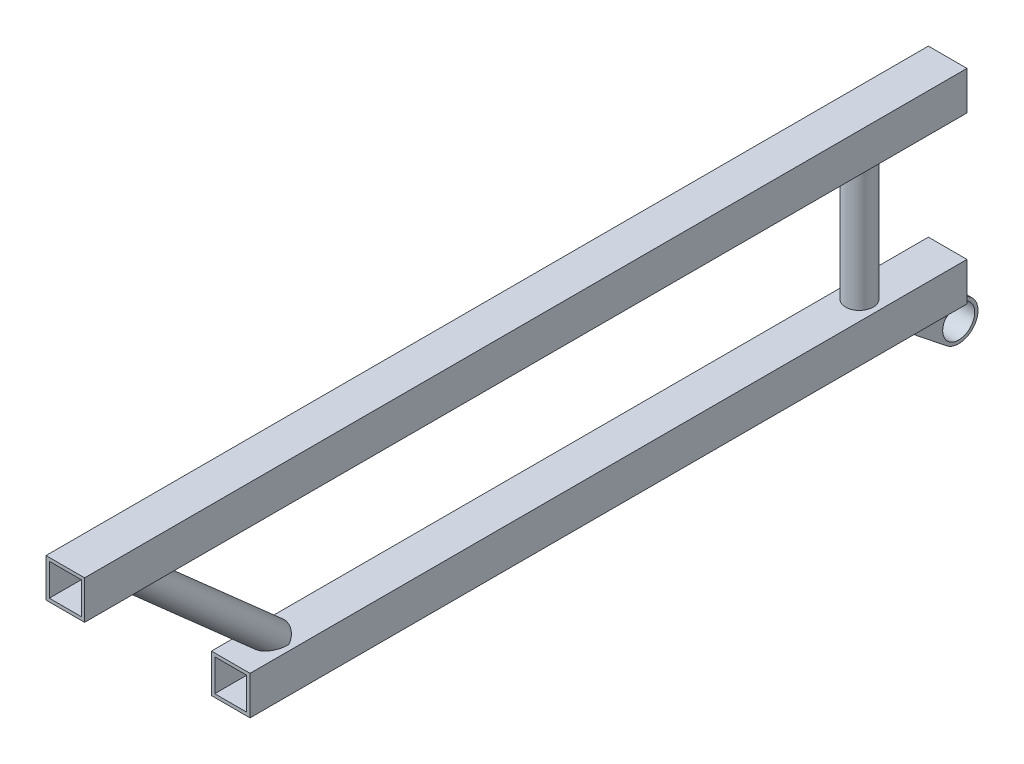
ISO-10303-21;
HEADER;
FILE_DESCRIPTION(('STEP AP214'),'2;1');
FILE_NAME('part.step','',(''),(''),'','','');
FILE_SCHEMA(('AUTOMOTIVE_DESIGN { 1 0 10303 214 1 1 1 1 }'));
ENDSEC;
DATA;
#1=APPLICATION_CONTEXT('core data for automotive mechanical design processes');
#2=APPLICATION_PROTOCOL_DEFINITION('international standard','automotive_design',2000,#1);
#3=PRODUCT_CONTEXT('',#1,'mechanical');
#4=PRODUCT('Part','Part','',(#3));
#5=PRODUCT_RELATED_PRODUCT_CATEGORY('part','',(#4));
#6=PRODUCT_DEFINITION_FORMATION('','',#4);
#7=PRODUCT_DEFINITION_CONTEXT('part definition',#1,'design');
#8=PRODUCT_DEFINITION('design','',#6,#7);
#9=PRODUCT_DEFINITION_SHAPE('','',#8);
#10=(LENGTH_UNIT() NAMED_UNIT(*) SI_UNIT(.MILLI.,.METRE.));
#11=(NAMED_UNIT(*) PLANE_ANGLE_UNIT() SI_UNIT($,.RADIAN.));
#12=(NAMED_UNIT(*) SI_UNIT($,.STERADIAN.) SOLID_ANGLE_UNIT());
#13=UNCERTAINTY_MEASURE_WITH_UNIT(LENGTH_MEASURE(1.E-05),#10,'distance_accuracy_value','');
#14=(GEOMETRIC_REPRESENTATION_CONTEXT(3) GLOBAL_UNCERTAINTY_ASSIGNED_CONTEXT((#13)) GLOBAL_UNIT_ASSIGNED_CONTEXT((#10,
#11,#12)) REPRESENTATION_CONTEXT('',''));
#15=CARTESIAN_POINT('',(0.,0.,0.));
#16=DIRECTION('',(0.,0.,1.));
#17=DIRECTION('',(1.,0.,0.));
#18=AXIS2_PLACEMENT_3D('',#15,#16,#17);
#19=CARTESIAN_POINT('',(0.,17.5,-40.));
#20=DIRECTION('',(0.,0.662573882203029,0.748996562490381));
#21=DIRECTION('',(0.,-0.748996562490381,0.662573882203029));
#22=AXIS2_PLACEMENT_3D('',#19,#20,#21);
#23=PLANE('',#22);
#24=DIRECTION('',(1.,0.,0.));
#25=VECTOR('',#24,1.);
#26=CARTESIAN_POINT('',(0.,17.5,-40.));
#27=LINE('',#26,#25);
#28=CARTESIAN_POINT('',(-12.5,17.5,-40.));
#29=VERTEX_POINT('',#28);
#30=CARTESIAN_POINT('',(-10.5,17.5,-40.));
#31=VERTEX_POINT('',#30);
#32=EDGE_CURVE('E300',#29,#31,#27,.T.);
#33=ORIENTED_EDGE('',*,*,#32,.F.);
#34=CARTESIAN_POINT('',(0.,17.5,-40.));
#35=DIRECTION('',(0.,0.662573882203029,0.748996562490381));
#36=DIRECTION('',(0.,-0.748996562490381,0.662573882203029));
#37=AXIS2_PLACEMENT_3D('',#34,#35,#36);
#38=CIRCLE('',#37,12.5);
#39=CARTESIAN_POINT('',(12.5,17.5,-40.));
#40=VERTEX_POINT('',#39);
#41=EDGE_CURVE('E308',#40,#29,#38,.T.);
#42=ORIENTED_EDGE('',*,*,#41,.F.);
#43=CARTESIAN_POINT('',(10.5,17.5,-40.));
#44=VERTEX_POINT('',#43);
#45=EDGE_CURVE('E297',#44,#40,#27,.T.);
#46=ORIENTED_EDGE('',*,*,#45,.F.);
#47=CARTESIAN_POINT('',(0.,17.5,-40.));
#48=DIRECTION('',(0.,0.662573882203029,0.748996562490381));
#49=DIRECTION('',(0.,-0.748996562490381,0.662573882203029));
#50=AXIS2_PLACEMENT_3D('',#47,#48,#49);
#51=CIRCLE('',#50,10.5);
#52=EDGE_CURVE('E312',#44,#31,#51,.T.);
#53=ORIENTED_EDGE('',*,*,#52,.T.);
#54=EDGE_LOOP('',(#33,#42,#46,#53));
#55=FACE_BOUND('',#54,.T.);
#56=ADVANCED_FACE('F42',(#55),#23,.F.);
#57=CARTESIAN_POINT('',(0.,161.890431658235,123.223966222353));
#58=DIRECTION('',(0.,-0.662573882203029,-0.748996562490381));
#59=DIRECTION('',(0.,0.748996562490381,-0.662573882203029));
#60=AXIS2_PLACEMENT_3D('',#57,#58,#59);
#61=CYLINDRICAL_SURFACE('',#60,12.5);
#62=CARTESIAN_POINT('',(0.,132.5,90.));
#63=DIRECTION('',(0.,-1.,0.));
#64=DIRECTION('',(0.,0.,-1.));
#65=AXIS2_PLACEMENT_3D('',#62,#63,#64);
#66=ELLIPSE('',#65,18.8658206062063,12.5);
#67=CARTESIAN_POINT('',(0.,132.5,71.1341793937937));
#68=VERTEX_POINT('',#67);
#69=EDGE_CURVE('E309',#68,#68,#66,.T.);
#70=ORIENTED_EDGE('',*,*,#69,.T.);
#71=EDGE_LOOP('',(#70));
#72=FACE_BOUND('',#71,.T.);
#73=CARTESIAN_POINT('',(0.,17.5,-40.));
#74=DIRECTION('',(0.,-1.,0.));
#75=DIRECTION('',(0.,0.,-1.));
#76=AXIS2_PLACEMENT_3D('',#73,#74,#75);
#77=ELLIPSE('',#76,18.8658206062063,12.5);
#78=EDGE_CURVE('E301',#40,#29,#77,.T.);
#79=ORIENTED_EDGE('',*,*,#78,.F.);
#80=ORIENTED_EDGE('',*,*,#41,.T.);
#81=EDGE_LOOP('',(#79,#80));
#82=FACE_BOUND('',#81,.T.);
#83=ADVANCED_FACE('F566',(#72,#82),#61,.T.);
#84=CARTESIAN_POINT('',(0.,161.890431658235,123.223966222353));
#85=DIRECTION('',(0.,-0.662573882203029,-0.748996562490381));
#86=DIRECTION('',(0.,0.748996562490381,-0.662573882203029));
#87=AXIS2_PLACEMENT_3D('',#84,#85,#86);
#88=CYLINDRICAL_SURFACE('',#87,10.5);
#89=CARTESIAN_POINT('',(0.,132.5,90.));
#90=DIRECTION('',(0.,-1.,0.));
#91=DIRECTION('',(0.,0.,-1.));
#92=AXIS2_PLACEMENT_3D('',#89,#90,#91);
#93=ELLIPSE('',#92,15.8472893092133,10.5);
#94=CARTESIAN_POINT('',(0.,132.5,74.1527106907867));
#95=VERTEX_POINT('',#94);
#96=EDGE_CURVE('E389',#95,#95,#93,.F.);
#97=ORIENTED_EDGE('',*,*,#96,.T.);
#98=EDGE_LOOP('',(#97));
#99=FACE_BOUND('',#98,.T.);
#100=ORIENTED_EDGE('',*,*,#52,.F.);
#101=CARTESIAN_POINT('',(0.,17.5,-40.));
#102=DIRECTION('',(0.,-1.,0.));
#103=DIRECTION('',(0.,0.,-1.));
#104=AXIS2_PLACEMENT_3D('',#101,#102,#103);
#105=ELLIPSE('',#104,15.8472893092133,10.5);
#106=EDGE_CURVE('E408',#44,#31,#105,.T.);
#107=ORIENTED_EDGE('',*,*,#106,.T.);
#108=EDGE_LOOP('',(#100,#107));
#109=FACE_BOUND('',#108,.T.);
#110=ADVANCED_FACE('F570',(#99,#109),#88,.F.);
#111=CARTESIAN_POINT('',(-17.5000000000001,0.,150.));
#112=DIRECTION('',(1.,0.,0.));
#113=DIRECTION('',(0.,1.,0.));
#114=AXIS2_PLACEMENT_3D('',#111,#112,#113);
#115=PLANE('',#114);
#116=DIRECTION('',(0.,-1.,0.));
#117=VECTOR('',#116,1.);
#118=CARTESIAN_POINT('',(-17.5000000000001,0.,-650.));
#119=LINE('',#118,#117);
#120=CARTESIAN_POINT('',(-17.5,167.5,-650.));
#121=VERTEX_POINT('',#120);
#122=CARTESIAN_POINT('',(-17.5,132.5,-650.));
#123=VERTEX_POINT('',#122);
#124=EDGE_CURVE('E361',#121,#123,#119,.T.);
#125=ORIENTED_EDGE('',*,*,#124,.T.);
#126=DIRECTION('',(0.,0.,-1.));
#127=VECTOR('',#126,1.);
#128=CARTESIAN_POINT('',(-17.5,132.5,150.));
#129=LINE('',#128,#127);
#130=CARTESIAN_POINT('',(-17.5,132.5,150.));
#131=VERTEX_POINT('',#130);
#132=EDGE_CURVE('E386',#131,#123,#129,.T.);
#133=ORIENTED_EDGE('',*,*,#132,.F.);
#134=DIRECTION('',(0.,-1.,0.));
#135=VECTOR('',#134,1.);
#136=CARTESIAN_POINT('',(-17.5000000000001,0.,150.));
#137=LINE('',#136,#135);
#138=CARTESIAN_POINT('',(-17.5,167.5,150.));
#139=VERTEX_POINT('',#138);
#140=EDGE_CURVE('E331',#139,#131,#137,.T.);
#141=ORIENTED_EDGE('',*,*,#140,.F.);
#142=DIRECTION('',(0.,0.,-1.));
#143=VECTOR('',#142,1.);
#144=CARTESIAN_POINT('',(-17.5,167.5,150.));
#145=LINE('',#144,#143);
#146=EDGE_CURVE('E375',#139,#121,#145,.T.);
#147=ORIENTED_EDGE('',*,*,#146,.T.);
#148=EDGE_LOOP('',(#125,#133,#141,#147));
#149=FACE_BOUND('',#148,.T.);
#150=ADVANCED_FACE('F589',(#149),#115,.F.);
#151=CARTESIAN_POINT('',(0.,132.5,150.));
#152=DIRECTION('',(0.,-1.,0.));
#153=DIRECTION('',(0.,0.,-1.));
#154=AXIS2_PLACEMENT_3D('',#151,#152,#153);
#155=PLANE('',#154);
#156=CARTESIAN_POINT('',(0.,132.5,-570.));
#157=DIRECTION('',(0.,-1.,0.));
#158=DIRECTION('',(0.,0.,-1.));
#159=AXIS2_PLACEMENT_3D('',#156,#157,#158);
#160=CIRCLE('',#159,12.5);
#161=CARTESIAN_POINT('',(0.,132.5,-582.5));
#162=VERTEX_POINT('',#161);
#163=EDGE_CURVE('E489',#162,#162,#160,.T.);
#164=ORIENTED_EDGE('',*,*,#163,.F.);
#165=EDGE_LOOP('',(#164));
#166=FACE_BOUND('',#165,.T.);
#167=ORIENTED_EDGE('',*,*,#69,.F.);
#168=EDGE_LOOP('',(#167));
#169=FACE_BOUND('',#168,.T.);
#170=DIRECTION('',(-1.,0.,0.));
#171=VECTOR('',#170,1.);
#172=CARTESIAN_POINT('',(0.,132.5,-650.));
#173=LINE('',#172,#171);
#174=CARTESIAN_POINT('',(17.5,132.5,-650.));
#175=VERTEX_POINT('',#174);
#176=EDGE_CURVE('E365',#175,#123,#173,.T.);
#177=ORIENTED_EDGE('',*,*,#176,.F.);
#178=DIRECTION('',(0.,0.,-1.));
#179=VECTOR('',#178,1.);
#180=CARTESIAN_POINT('',(17.5,132.5,150.));
#181=LINE('',#180,#179);
#182=CARTESIAN_POINT('',(17.5,132.5,150.));
#183=VERTEX_POINT('',#182);
#184=EDGE_CURVE('E383',#183,#175,#181,.T.);
#185=ORIENTED_EDGE('',*,*,#184,.F.);
#186=DIRECTION('',(-1.,0.,0.));
#187=VECTOR('',#186,1.);
#188=CARTESIAN_POINT('',(0.,132.5,150.));
#189=LINE('',#188,#187);
#190=EDGE_CURVE('E334',#183,#131,#189,.T.);
#191=ORIENTED_EDGE('',*,*,#190,.T.);
#192=ORIENTED_EDGE('',*,*,#132,.T.);
#193=EDGE_LOOP('',(#177,#185,#191,#192));
#194=FACE_BOUND('',#193,.T.);
#195=ADVANCED_FACE('F512',(#166,#169,#194),#155,.T.);
#196=CARTESIAN_POINT('',(17.5,0.,150.));
#197=DIRECTION('',(1.,0.,0.));
#198=DIRECTION('',(0.,1.,0.));
#199=AXIS2_PLACEMENT_3D('',#196,#197,#198);
#200=PLANE('',#199);
#201=DIRECTION('',(0.,-1.,0.));
#202=VECTOR('',#201,1.);
#203=CARTESIAN_POINT('',(17.5,0.,-650.));
#204=LINE('',#203,#202);
#205=CARTESIAN_POINT('',(17.5,167.5,-650.));
#206=VERTEX_POINT('',#205);
#207=EDGE_CURVE('E369',#206,#175,#204,.T.);
#208=ORIENTED_EDGE('',*,*,#207,.F.);
#209=DIRECTION('',(0.,0.,-1.));
#210=VECTOR('',#209,1.);
#211=CARTESIAN_POINT('',(17.5,167.5,150.));
#212=LINE('',#211,#210);
#213=CARTESIAN_POINT('',(17.5,167.5,150.));
#214=VERTEX_POINT('',#213);
#215=EDGE_CURVE('E379',#214,#206,#212,.T.);
#216=ORIENTED_EDGE('',*,*,#215,.F.);
#217=DIRECTION('',(0.,-1.,0.));
#218=VECTOR('',#217,1.);
#219=CARTESIAN_POINT('',(17.5,0.,150.));
#220=LINE('',#219,#218);
#221=EDGE_CURVE('E338',#214,#183,#220,.T.);
#222=ORIENTED_EDGE('',*,*,#221,.T.);
#223=ORIENTED_EDGE('',*,*,#184,.T.);
#224=EDGE_LOOP('',(#208,#216,#222,#223));
#225=FACE_BOUND('',#224,.T.);
#226=ADVANCED_FACE('F584',(#225),#200,.T.);
#227=CARTESIAN_POINT('',(0.,135.5,150.));
#228=DIRECTION('',(0.,-1.,0.));
#229=DIRECTION('',(0.,0.,-1.));
#230=AXIS2_PLACEMENT_3D('',#227,#228,#229);
#231=PLANE('',#230);
#232=DIRECTION('',(-1.,0.,0.));
#233=VECTOR('',#232,1.);
#234=CARTESIAN_POINT('',(0.,135.5,-650.));
#235=LINE('',#234,#233);
#236=CARTESIAN_POINT('',(14.5,135.5,-650.));
#237=VERTEX_POINT('',#236);
#238=CARTESIAN_POINT('',(-14.5,135.5,-650.));
#239=VERTEX_POINT('',#238);
#240=EDGE_CURVE('E346',#237,#239,#235,.T.);
#241=ORIENTED_EDGE('',*,*,#240,.T.);
#242=DIRECTION('',(0.,0.,-1.));
#243=VECTOR('',#242,1.);
#244=CARTESIAN_POINT('',(-14.5,135.5,150.));
#245=LINE('',#244,#243);
#246=CARTESIAN_POINT('',(-14.5,135.5,150.));
#247=VERTEX_POINT('',#246);
#248=EDGE_CURVE('E380',#247,#239,#245,.T.);
#249=ORIENTED_EDGE('',*,*,#248,.F.);
#250=DIRECTION('',(-1.,0.,0.));
#251=VECTOR('',#250,1.);
#252=CARTESIAN_POINT('',(0.,135.5,150.));
#253=LINE('',#252,#251);
#254=CARTESIAN_POINT('',(14.5,135.5,150.));
#255=VERTEX_POINT('',#254);
#256=EDGE_CURVE('E316',#255,#247,#253,.T.);
#257=ORIENTED_EDGE('',*,*,#256,.F.);
#258=DIRECTION('',(0.,0.,-1.));
#259=VECTOR('',#258,1.);
#260=CARTESIAN_POINT('',(14.5,135.5,150.));
#261=LINE('',#260,#259);
#262=EDGE_CURVE('E345',#255,#237,#261,.T.);
#263=ORIENTED_EDGE('',*,*,#262,.T.);
#264=EDGE_LOOP('',(#241,#249,#257,#263));
#265=FACE_BOUND('',#264,.T.);
#266=ADVANCED_FACE('F44',(#265),#231,.F.);
#267=CARTESIAN_POINT('',(-14.5,0.,150.));
#268=DIRECTION('',(1.,0.,0.));
#269=DIRECTION('',(0.,1.,0.));
#270=AXIS2_PLACEMENT_3D('',#267,#268,#269);
#271=PLANE('',#270);
#272=DIRECTION('',(0.,-1.,0.));
#273=VECTOR('',#272,1.);
#274=CARTESIAN_POINT('',(-14.5,0.,-650.));
#275=LINE('',#274,#273);
#276=CARTESIAN_POINT('',(-14.5,164.5,-650.));
#277=VERTEX_POINT('',#276);
#278=EDGE_CURVE('E350',#277,#239,#275,.T.);
#279=ORIENTED_EDGE('',*,*,#278,.F.);
#280=DIRECTION('',(0.,0.,-1.));
#281=VECTOR('',#280,1.);
#282=CARTESIAN_POINT('',(-14.5,164.5,150.));
#283=LINE('',#282,#281);
#284=CARTESIAN_POINT('',(-14.5,164.5,150.));
#285=VERTEX_POINT('',#284);
#286=EDGE_CURVE('E396',#285,#277,#283,.T.);
#287=ORIENTED_EDGE('',*,*,#286,.F.);
#288=DIRECTION('',(0.,-1.,0.));
#289=VECTOR('',#288,1.);
#290=CARTESIAN_POINT('',(-14.5,0.,150.));
#291=LINE('',#290,#289);
#292=EDGE_CURVE('E319',#285,#247,#291,.T.);
#293=ORIENTED_EDGE('',*,*,#292,.T.);
#294=ORIENTED_EDGE('',*,*,#248,.T.);
#295=EDGE_LOOP('',(#279,#287,#293,#294));
#296=FACE_BOUND('',#295,.T.);
#297=ADVANCED_FACE('F599',(#296),#271,.T.);
#298=CARTESIAN_POINT('',(0.,164.5,150.));
#299=DIRECTION('',(0.,-1.,0.));
#300=DIRECTION('',(0.,0.,-1.));
#301=AXIS2_PLACEMENT_3D('',#298,#299,#300);
#302=PLANE('',#301);
#303=DIRECTION('',(-1.,0.,0.));
#304=VECTOR('',#303,1.);
#305=CARTESIAN_POINT('',(0.,164.5,-650.));
#306=LINE('',#305,#304);
#307=CARTESIAN_POINT('',(14.5,164.5,-650.));
#308=VERTEX_POINT('',#307);
#309=EDGE_CURVE('E354',#308,#277,#306,.T.);
#310=ORIENTED_EDGE('',*,*,#309,.F.);
#311=DIRECTION('',(0.,0.,-1.));
#312=VECTOR('',#311,1.);
#313=CARTESIAN_POINT('',(14.5,164.5,150.));
#314=LINE('',#313,#312);
#315=CARTESIAN_POINT('',(14.5,164.5,150.));
#316=VERTEX_POINT('',#315);
#317=EDGE_CURVE('E393',#316,#308,#314,.T.);
#318=ORIENTED_EDGE('',*,*,#317,.F.);
#319=DIRECTION('',(-1.,0.,0.));
#320=VECTOR('',#319,1.);
#321=CARTESIAN_POINT('',(0.,164.5,150.));
#322=LINE('',#321,#320);
#323=EDGE_CURVE('E324',#316,#285,#322,.T.);
#324=ORIENTED_EDGE('',*,*,#323,.T.);
#325=ORIENTED_EDGE('',*,*,#286,.T.);
#326=EDGE_LOOP('',(#310,#318,#324,#325));
#327=FACE_BOUND('',#326,.T.);
#328=ADVANCED_FACE('F596',(#327),#302,.T.);
#329=CARTESIAN_POINT('',(14.5,0.,150.));
#330=DIRECTION('',(1.,0.,0.));
#331=DIRECTION('',(0.,1.,0.));
#332=AXIS2_PLACEMENT_3D('',#329,#330,#331);
#333=PLANE('',#332);
#334=DIRECTION('',(0.,-1.,0.));
#335=VECTOR('',#334,1.);
#336=CARTESIAN_POINT('',(14.5,0.,-650.));
#337=LINE('',#336,#335);
#338=EDGE_CURVE('E358',#308,#237,#337,.T.);
#339=ORIENTED_EDGE('',*,*,#338,.T.);
#340=ORIENTED_EDGE('',*,*,#262,.F.);
#341=DIRECTION('',(0.,-1.,0.));
#342=VECTOR('',#341,1.);
#343=CARTESIAN_POINT('',(14.5,0.,150.));
#344=LINE('',#343,#342);
#345=EDGE_CURVE('E328',#316,#255,#344,.T.);
#346=ORIENTED_EDGE('',*,*,#345,.F.);
#347=ORIENTED_EDGE('',*,*,#317,.T.);
#348=EDGE_LOOP('',(#339,#340,#346,#347));
#349=FACE_BOUND('',#348,.T.);
#350=ADVANCED_FACE('F582',(#349),#333,.F.);
#351=CARTESIAN_POINT('',(1.32830254731938E-13,167.5,150.));
#352=DIRECTION('',(0.,-1.,0.));
#353=DIRECTION('',(1.,0.,0.));
#354=AXIS2_PLACEMENT_3D('',#351,#352,#353);
#355=PLANE('',#354);
#356=DIRECTION('',(-1.,0.,0.));
#357=VECTOR('',#356,1.);
#358=CARTESIAN_POINT('',(1.32830254731938E-13,167.5,-650.));
#359=LINE('',#358,#357);
#360=EDGE_CURVE('E320',#206,#121,#359,.T.);
#361=ORIENTED_EDGE('',*,*,#360,.T.);
#362=ORIENTED_EDGE('',*,*,#146,.F.);
#363=DIRECTION('',(-1.,0.,0.));
#364=VECTOR('',#363,1.);
#365=CARTESIAN_POINT('',(1.32830254731938E-13,167.5,150.));
#366=LINE('',#365,#364);
#367=EDGE_CURVE('E342',#214,#139,#366,.T.);
#368=ORIENTED_EDGE('',*,*,#367,.F.);
#369=ORIENTED_EDGE('',*,*,#215,.T.);
#370=EDGE_LOOP('',(#361,#362,#368,#369));
#371=FACE_BOUND('',#370,.T.);
#372=ADVANCED_FACE('F575',(#371),#355,.F.);
#373=CARTESIAN_POINT('',(0.,0.,150.));
#374=DIRECTION('',(0.,0.,1.));
#375=DIRECTION('',(1.,0.,0.));
#376=AXIS2_PLACEMENT_3D('',#373,#374,#375);
#377=PLANE('',#376);
#378=ORIENTED_EDGE('',*,*,#256,.T.);
#379=ORIENTED_EDGE('',*,*,#292,.F.);
#380=ORIENTED_EDGE('',*,*,#323,.F.);
#381=ORIENTED_EDGE('',*,*,#345,.T.);
#382=EDGE_LOOP('',(#378,#379,#380,#381));
#383=FACE_BOUND('',#382,.T.);
#384=ORIENTED_EDGE('',*,*,#140,.T.);
#385=ORIENTED_EDGE('',*,*,#190,.F.);
#386=ORIENTED_EDGE('',*,*,#221,.F.);
#387=ORIENTED_EDGE('',*,*,#367,.T.);
#388=EDGE_LOOP('',(#384,#385,#386,#387));
#389=FACE_BOUND('',#388,.T.);
#390=ADVANCED_FACE('F571',(#383,#389),#377,.T.);
#391=CARTESIAN_POINT('',(0.,0.,-650.));
#392=DIRECTION('',(0.,0.,1.));
#393=DIRECTION('',(1.,0.,0.));
#394=AXIS2_PLACEMENT_3D('',#391,#392,#393);
#395=PLANE('',#394);
#396=ORIENTED_EDGE('',*,*,#240,.F.);
#397=ORIENTED_EDGE('',*,*,#338,.F.);
#398=ORIENTED_EDGE('',*,*,#309,.T.);
#399=ORIENTED_EDGE('',*,*,#278,.T.);
#400=EDGE_LOOP('',(#396,#397,#398,#399));
#401=FACE_BOUND('',#400,.T.);
#402=ORIENTED_EDGE('',*,*,#124,.F.);
#403=ORIENTED_EDGE('',*,*,#360,.F.);
#404=ORIENTED_EDGE('',*,*,#207,.T.);
#405=ORIENTED_EDGE('',*,*,#176,.T.);
#406=EDGE_LOOP('',(#402,#403,#404,#405));
#407=FACE_BOUND('',#406,.T.);
#408=ADVANCED_FACE('F574',(#401,#407),#395,.F.);
#409=ORIENTED_EDGE('',*,*,#96,.F.);
#410=EDGE_LOOP('',(#409));
#411=FACE_BOUND('',#410,.T.);
#412=ADVANCED_FACE('F511',(#411),#155,.T.);
#413=CARTESIAN_POINT('',(0.,-17.5,0.));
#414=DIRECTION('',(0.,-1.,0.));
#415=DIRECTION('',(0.,0.,-1.));
#416=AXIS2_PLACEMENT_3D('',#413,#414,#415);
#417=PLANE('',#416);
#418=DIRECTION('',(-1.,0.,0.));
#419=VECTOR('',#418,1.);
#420=CARTESIAN_POINT('',(0.,-17.5,-650.));
#421=LINE('',#420,#419);
#422=CARTESIAN_POINT('',(-10.,-17.5,-650.));
#423=VERTEX_POINT('',#422);
#424=CARTESIAN_POINT('',(-17.5,-17.5,-650.));
#425=VERTEX_POINT('',#424);
#426=EDGE_CURVE('E242',#423,#425,#421,.T.);
#427=ORIENTED_EDGE('',*,*,#426,.F.);
#428=DIRECTION('',(0.,0.,1.));
#429=VECTOR('',#428,1.);
#430=CARTESIAN_POINT('',(-10.,-17.5,-600.));
#431=LINE('',#430,#429);
#432=CARTESIAN_POINT('',(-10.,-17.5,-600.));
#433=VERTEX_POINT('',#432);
#434=EDGE_CURVE('E475',#423,#433,#431,.T.);
#435=ORIENTED_EDGE('',*,*,#434,.T.);
#436=DIRECTION('',(1.,0.,0.));
#437=VECTOR('',#436,1.);
#438=CARTESIAN_POINT('',(-10.,-17.5,-600.));
#439=LINE('',#438,#437);
#440=CARTESIAN_POINT('',(10.,-17.5,-600.));
#441=VERTEX_POINT('',#440);
#442=EDGE_CURVE('E210',#433,#441,#439,.T.);
#443=ORIENTED_EDGE('',*,*,#442,.T.);
#444=DIRECTION('',(0.,0.,1.));
#445=VECTOR('',#444,1.);
#446=CARTESIAN_POINT('',(10.,-17.5,-600.));
#447=LINE('',#446,#445);
#448=CARTESIAN_POINT('',(10.,-17.5000000000001,-650.));
#449=VERTEX_POINT('',#448);
#450=EDGE_CURVE('E218',#449,#441,#447,.T.);
#451=ORIENTED_EDGE('',*,*,#450,.F.);
#452=CARTESIAN_POINT('',(17.5,-17.5,-650.));
#453=VERTEX_POINT('',#452);
#454=EDGE_CURVE('E229',#453,#449,#421,.T.);
#455=ORIENTED_EDGE('',*,*,#454,.F.);
#456=DIRECTION('',(0.,0.,-1.));
#457=VECTOR('',#456,1.);
#458=CARTESIAN_POINT('',(17.5,-17.5,0.));
#459=LINE('',#458,#457);
#460=CARTESIAN_POINT('',(17.5,-17.5,0.));
#461=VERTEX_POINT('',#460);
#462=EDGE_CURVE('E281',#461,#453,#459,.T.);
#463=ORIENTED_EDGE('',*,*,#462,.F.);
#464=DIRECTION('',(-1.,0.,0.));
#465=VECTOR('',#464,1.);
#466=CARTESIAN_POINT('',(0.,-17.5,0.));
#467=LINE('',#466,#465);
#468=CARTESIAN_POINT('',(-17.5,-17.5,0.));
#469=VERTEX_POINT('',#468);
#470=EDGE_CURVE('E457',#461,#469,#467,.T.);
#471=ORIENTED_EDGE('',*,*,#470,.T.);
#472=DIRECTION('',(0.,0.,-1.));
#473=VECTOR('',#472,1.);
#474=CARTESIAN_POINT('',(-17.5,-17.5,0.));
#475=LINE('',#474,#473);
#476=EDGE_CURVE('E277',#469,#425,#475,.T.);
#477=ORIENTED_EDGE('',*,*,#476,.T.);
#478=EDGE_LOOP('',(#427,#435,#443,#451,#455,#463,#471,#477));
#479=FACE_BOUND('',#478,.T.);
#480=ADVANCED_FACE('F228',(#479),#417,.T.);
#481=CARTESIAN_POINT('',(14.5,0.,0.));
#482=DIRECTION('',(1.,0.,0.));
#483=DIRECTION('',(0.,1.,0.));
#484=AXIS2_PLACEMENT_3D('',#481,#482,#483);
#485=PLANE('',#484);
#486=DIRECTION('',(0.,-1.,0.));
#487=VECTOR('',#486,1.);
#488=CARTESIAN_POINT('',(14.5,0.,-650.));
#489=LINE('',#488,#487);
#490=CARTESIAN_POINT('',(14.5,14.5,-650.));
#491=VERTEX_POINT('',#490);
#492=CARTESIAN_POINT('',(14.5,-14.5,-650.));
#493=VERTEX_POINT('',#492);
#494=EDGE_CURVE('E241',#491,#493,#489,.T.);
#495=ORIENTED_EDGE('',*,*,#494,.T.);
#496=DIRECTION('',(0.,0.,-1.));
#497=VECTOR('',#496,1.);
#498=CARTESIAN_POINT('',(14.5,-14.5,0.));
#499=LINE('',#498,#497);
#500=CARTESIAN_POINT('',(14.5,-14.5,0.));
#501=VERTEX_POINT('',#500);
#502=EDGE_CURVE('E264',#501,#493,#499,.T.);
#503=ORIENTED_EDGE('',*,*,#502,.F.);
#504=DIRECTION('',(0.,-1.,0.));
#505=VECTOR('',#504,1.);
#506=CARTESIAN_POINT('',(14.5,0.,0.));
#507=LINE('',#506,#505);
#508=CARTESIAN_POINT('',(14.5,14.5,0.));
#509=VERTEX_POINT('',#508);
#510=EDGE_CURVE('E453',#509,#501,#507,.T.);
#511=ORIENTED_EDGE('',*,*,#510,.F.);
#512=DIRECTION('',(0.,0.,-1.));
#513=VECTOR('',#512,1.);
#514=CARTESIAN_POINT('',(14.5,14.5,0.));
#515=LINE('',#514,#513);
#516=EDGE_CURVE('E274',#509,#491,#515,.T.);
#517=ORIENTED_EDGE('',*,*,#516,.T.);
#518=EDGE_LOOP('',(#495,#503,#511,#517));
#519=FACE_BOUND('',#518,.T.);
#520=ADVANCED_FACE('F542',(#519),#485,.F.);
#521=CARTESIAN_POINT('',(0.,-14.5,0.));
#522=DIRECTION('',(0.,-1.,0.));
#523=DIRECTION('',(1.,0.,0.));
#524=AXIS2_PLACEMENT_3D('',#521,#522,#523);
#525=PLANE('',#524);
#526=DIRECTION('',(-1.,0.,0.));
#527=VECTOR('',#526,1.);
#528=CARTESIAN_POINT('',(0.,-14.5,-650.));
#529=LINE('',#528,#527);
#530=CARTESIAN_POINT('',(-14.5,-14.5,-650.));
#531=VERTEX_POINT('',#530);
#532=EDGE_CURVE('E259',#493,#531,#529,.T.);
#533=ORIENTED_EDGE('',*,*,#532,.T.);
#534=DIRECTION('',(0.,0.,-1.));
#535=VECTOR('',#534,1.);
#536=CARTESIAN_POINT('',(-14.5,-14.5,0.));
#537=LINE('',#536,#535);
#538=CARTESIAN_POINT('',(-14.5,-14.5,0.));
#539=VERTEX_POINT('',#538);
#540=EDGE_CURVE('E268',#539,#531,#537,.T.);
#541=ORIENTED_EDGE('',*,*,#540,.F.);
#542=DIRECTION('',(-1.,0.,0.));
#543=VECTOR('',#542,1.);
#544=CARTESIAN_POINT('',(0.,-14.5,0.));
#545=LINE('',#544,#543);
#546=EDGE_CURVE('E291',#501,#539,#545,.T.);
#547=ORIENTED_EDGE('',*,*,#546,.F.);
#548=ORIENTED_EDGE('',*,*,#502,.T.);
#549=EDGE_LOOP('',(#533,#541,#547,#548));
#550=FACE_BOUND('',#549,.T.);
#551=ADVANCED_FACE('F538',(#550),#525,.F.);
#552=CARTESIAN_POINT('',(-14.5,0.,0.));
#553=DIRECTION('',(1.,0.,0.));
#554=DIRECTION('',(0.,1.,0.));
#555=AXIS2_PLACEMENT_3D('',#552,#553,#554);
#556=PLANE('',#555);
#557=DIRECTION('',(0.,-1.,0.));
#558=VECTOR('',#557,1.);
#559=CARTESIAN_POINT('',(-14.5,0.,-650.));
#560=LINE('',#559,#558);
#561=CARTESIAN_POINT('',(-14.5,14.5,-650.));
#562=VERTEX_POINT('',#561);
#563=EDGE_CURVE('E255',#562,#531,#560,.T.);
#564=ORIENTED_EDGE('',*,*,#563,.F.);
#565=DIRECTION('',(0.,0.,-1.));
#566=VECTOR('',#565,1.);
#567=CARTESIAN_POINT('',(-14.5,14.5,0.));
#568=LINE('',#567,#566);
#569=CARTESIAN_POINT('',(-14.5,14.5,0.));
#570=VERTEX_POINT('',#569);
#571=EDGE_CURVE('E271',#570,#562,#568,.T.);
#572=ORIENTED_EDGE('',*,*,#571,.F.);
#573=DIRECTION('',(0.,-1.,0.));
#574=VECTOR('',#573,1.);
#575=CARTESIAN_POINT('',(-14.5,0.,0.));
#576=LINE('',#575,#574);
#577=EDGE_CURVE('E445',#570,#539,#576,.T.);
#578=ORIENTED_EDGE('',*,*,#577,.T.);
#579=ORIENTED_EDGE('',*,*,#540,.T.);
#580=EDGE_LOOP('',(#564,#572,#578,#579));
#581=FACE_BOUND('',#580,.T.);
#582=ADVANCED_FACE('F541',(#581),#556,.T.);
#583=CARTESIAN_POINT('',(-17.5,0.,0.));
#584=DIRECTION('',(1.,0.,0.));
#585=DIRECTION('',(0.,0.,-1.));
#586=AXIS2_PLACEMENT_3D('',#583,#584,#585);
#587=PLANE('',#586);
#588=DIRECTION('',(0.,-1.,0.));
#589=VECTOR('',#588,1.);
#590=CARTESIAN_POINT('',(-17.5,0.,-650.));
#591=LINE('',#590,#589);
#592=CARTESIAN_POINT('',(-17.5,17.5,-650.));
#593=VERTEX_POINT('',#592);
#594=EDGE_CURVE('E432',#593,#425,#591,.T.);
#595=ORIENTED_EDGE('',*,*,#594,.T.);
#596=ORIENTED_EDGE('',*,*,#476,.F.);
#597=DIRECTION('',(0.,-1.,0.));
#598=VECTOR('',#597,1.);
#599=CARTESIAN_POINT('',(-17.5,0.,0.));
#600=LINE('',#599,#598);
#601=CARTESIAN_POINT('',(-17.5,17.5,0.));
#602=VERTEX_POINT('',#601);
#603=EDGE_CURVE('E263',#602,#469,#600,.T.);
#604=ORIENTED_EDGE('',*,*,#603,.F.);
#605=DIRECTION('',(0.,0.,-1.));
#606=VECTOR('',#605,1.);
#607=CARTESIAN_POINT('',(-17.5,17.5,0.));
#608=LINE('',#607,#606);
#609=EDGE_CURVE('E287',#602,#593,#608,.T.);
#610=ORIENTED_EDGE('',*,*,#609,.T.);
#611=EDGE_LOOP('',(#595,#596,#604,#610));
#612=FACE_BOUND('',#611,.T.);
#613=ADVANCED_FACE('F435',(#612),#587,.F.);
#614=CARTESIAN_POINT('',(17.5,0.,0.));
#615=DIRECTION('',(1.,0.,0.));
#616=DIRECTION('',(0.,0.,-1.));
#617=AXIS2_PLACEMENT_3D('',#614,#615,#616);
#618=PLANE('',#617);
#619=DIRECTION('',(0.,-1.,0.));
#620=VECTOR('',#619,1.);
#621=CARTESIAN_POINT('',(17.5,0.,-650.));
#622=LINE('',#621,#620);
#623=CARTESIAN_POINT('',(17.5,17.5,-650.));
#624=VERTEX_POINT('',#623);
#625=EDGE_CURVE('E239',#624,#453,#622,.T.);
#626=ORIENTED_EDGE('',*,*,#625,.F.);
#627=DIRECTION('',(0.,0.,-1.));
#628=VECTOR('',#627,1.);
#629=CARTESIAN_POINT('',(17.5,17.5,0.));
#630=LINE('',#629,#628);
#631=CARTESIAN_POINT('',(17.5,17.5,0.));
#632=VERTEX_POINT('',#631);
#633=EDGE_CURVE('E284',#632,#624,#630,.T.);
#634=ORIENTED_EDGE('',*,*,#633,.F.);
#635=DIRECTION('',(0.,-1.,0.));
#636=VECTOR('',#635,1.);
#637=CARTESIAN_POINT('',(17.5,0.,0.));
#638=LINE('',#637,#636);
#639=EDGE_CURVE('E461',#632,#461,#638,.T.);
#640=ORIENTED_EDGE('',*,*,#639,.T.);
#641=ORIENTED_EDGE('',*,*,#462,.T.);
#642=EDGE_LOOP('',(#626,#634,#640,#641));
#643=FACE_BOUND('',#642,.T.);
#644=ADVANCED_FACE('F421',(#643),#618,.T.);
#645=CARTESIAN_POINT('',(0.,17.5,0.));
#646=DIRECTION('',(0.,-1.,0.));
#647=DIRECTION('',(0.,0.,-1.));
#648=AXIS2_PLACEMENT_3D('',#645,#646,#647);
#649=PLANE('',#648);
#650=CARTESIAN_POINT('',(0.,17.5,-570.));
#651=DIRECTION('',(0.,-1.,0.));
#652=DIRECTION('',(0.,0.,-1.));
#653=AXIS2_PLACEMENT_3D('',#650,#651,#652);
#654=CIRCLE('',#653,12.5);
#655=CARTESIAN_POINT('',(0.,17.5,-582.5));
#656=VERTEX_POINT('',#655);
#657=EDGE_CURVE('E52',#656,#656,#654,.F.);
#658=ORIENTED_EDGE('',*,*,#657,.F.);
#659=EDGE_LOOP('',(#658));
#660=FACE_BOUND('',#659,.T.);
#661=ORIENTED_EDGE('',*,*,#45,.T.);
#662=ORIENTED_EDGE('',*,*,#78,.T.);
#663=ORIENTED_EDGE('',*,*,#32,.T.);
#664=ORIENTED_EDGE('',*,*,#106,.F.);
#665=EDGE_LOOP('',(#661,#662,#663,#664));
#666=FACE_BOUND('',#665,.T.);
#667=DIRECTION('',(-1.,0.,0.));
#668=VECTOR('',#667,1.);
#669=CARTESIAN_POINT('',(0.,17.5,-650.));
#670=LINE('',#669,#668);
#671=EDGE_CURVE('E428',#624,#593,#670,.T.);
#672=ORIENTED_EDGE('',*,*,#671,.T.);
#673=ORIENTED_EDGE('',*,*,#609,.F.);
#674=DIRECTION('',(-1.,0.,0.));
#675=VECTOR('',#674,1.);
#676=CARTESIAN_POINT('',(0.,17.5,0.));
#677=LINE('',#676,#675);
#678=EDGE_CURVE('E465',#632,#602,#677,.T.);
#679=ORIENTED_EDGE('',*,*,#678,.F.);
#680=ORIENTED_EDGE('',*,*,#633,.T.);
#681=EDGE_LOOP('',(#672,#673,#679,#680));
#682=FACE_BOUND('',#681,.T.);
#683=ADVANCED_FACE('F417',(#660,#666,#682),#649,.F.);
#684=CARTESIAN_POINT('',(0.,14.5,0.));
#685=DIRECTION('',(0.,-1.,0.));
#686=DIRECTION('',(0.,0.,-1.));
#687=AXIS2_PLACEMENT_3D('',#684,#685,#686);
#688=PLANE('',#687);
#689=CARTESIAN_POINT('',(0.,14.5,-43.3913043478261));
#690=DIRECTION('',(0.,-1.,0.));
#691=DIRECTION('',(0.,0.,-1.));
#692=AXIS2_PLACEMENT_3D('',#689,#690,#691);
#693=ELLIPSE('',#692,18.8658206062063,12.5);
#694=CARTESIAN_POINT('',(11.8409079293657,14.5,-37.3461538461539));
#695=VERTEX_POINT('',#694);
#696=CARTESIAN_POINT('',(-11.8409079293657,14.5,-37.3461538461539));
#697=VERTEX_POINT('',#696);
#698=EDGE_CURVE('E58',#695,#697,#693,.T.);
#699=ORIENTED_EDGE('',*,*,#698,.F.);
#700=DIRECTION('',(1.,0.,0.));
#701=VECTOR('',#700,1.);
#702=CARTESIAN_POINT('',(0.,14.5,-37.3461538461538));
#703=LINE('',#702,#701);
#704=CARTESIAN_POINT('',(9.70603423606759,14.5,-37.3461538461539));
#705=VERTEX_POINT('',#704);
#706=EDGE_CURVE('E65',#705,#695,#703,.T.);
#707=ORIENTED_EDGE('',*,*,#706,.F.);
#708=CARTESIAN_POINT('',(0.,14.5,-43.3913043478261));
#709=DIRECTION('',(0.,-1.,0.));
#710=DIRECTION('',(0.,0.,-1.));
#711=AXIS2_PLACEMENT_3D('',#708,#709,#710);
#712=ELLIPSE('',#711,15.8472893092133,10.5);
#713=CARTESIAN_POINT('',(-9.70603423606759,14.5,-37.3461538461539));
#714=VERTEX_POINT('',#713);
#715=EDGE_CURVE('E404',#705,#714,#712,.T.);
#716=ORIENTED_EDGE('',*,*,#715,.T.);
#717=EDGE_CURVE('E294',#697,#714,#703,.T.);
#718=ORIENTED_EDGE('',*,*,#717,.F.);
#719=EDGE_LOOP('',(#699,#707,#716,#718));
#720=FACE_BOUND('',#719,.T.);
#721=DIRECTION('',(-1.,0.,0.));
#722=VECTOR('',#721,1.);
#723=CARTESIAN_POINT('',(0.,14.5,-650.));
#724=LINE('',#723,#722);
#725=EDGE_CURVE('E247',#491,#562,#724,.T.);
#726=ORIENTED_EDGE('',*,*,#725,.F.);
#727=ORIENTED_EDGE('',*,*,#516,.F.);
#728=DIRECTION('',(-1.,0.,0.));
#729=VECTOR('',#728,1.);
#730=CARTESIAN_POINT('',(0.,14.5,0.));
#731=LINE('',#730,#729);
#732=EDGE_CURVE('E449',#509,#570,#731,.T.);
#733=ORIENTED_EDGE('',*,*,#732,.T.);
#734=ORIENTED_EDGE('',*,*,#571,.T.);
#735=EDGE_LOOP('',(#726,#727,#733,#734));
#736=FACE_BOUND('',#735,.T.);
#737=ADVANCED_FACE('F420',(#720,#736),#688,.T.);
#738=CARTESIAN_POINT('',(0.,0.,0.));
#739=DIRECTION('',(0.,0.,-1.));
#740=DIRECTION('',(-1.,0.,0.));
#741=AXIS2_PLACEMENT_3D('',#738,#739,#740);
#742=PLANE('',#741);
#743=ORIENTED_EDGE('',*,*,#603,.T.);
#744=ORIENTED_EDGE('',*,*,#470,.F.);
#745=ORIENTED_EDGE('',*,*,#639,.F.);
#746=ORIENTED_EDGE('',*,*,#678,.T.);
#747=EDGE_LOOP('',(#743,#744,#745,#746));
#748=FACE_BOUND('',#747,.T.);
#749=ORIENTED_EDGE('',*,*,#510,.T.);
#750=ORIENTED_EDGE('',*,*,#546,.T.);
#751=ORIENTED_EDGE('',*,*,#577,.F.);
#752=ORIENTED_EDGE('',*,*,#732,.F.);
#753=EDGE_LOOP('',(#749,#750,#751,#752));
#754=FACE_BOUND('',#753,.T.);
#755=ADVANCED_FACE('F532',(#748,#754),#742,.F.);
#756=CARTESIAN_POINT('',(0.,0.,-650.));
#757=DIRECTION('',(0.,0.,-1.));
#758=DIRECTION('',(-1.,0.,0.));
#759=AXIS2_PLACEMENT_3D('',#756,#757,#758);
#760=PLANE('',#759);
#761=ORIENTED_EDGE('',*,*,#594,.F.);
#762=ORIENTED_EDGE('',*,*,#671,.F.);
#763=ORIENTED_EDGE('',*,*,#625,.T.);
#764=ORIENTED_EDGE('',*,*,#454,.T.);
#765=DIRECTION('',(1.,0.,0.));
#766=VECTOR('',#765,1.);
#767=CARTESIAN_POINT('',(-10.,-17.5000000000001,-650.));
#768=LINE('',#767,#766);
#769=EDGE_CURVE('E200',#423,#449,#768,.T.);
#770=ORIENTED_EDGE('',*,*,#769,.F.);
#771=ORIENTED_EDGE('',*,*,#426,.T.);
#772=EDGE_LOOP('',(#761,#762,#763,#764,#770,#771));
#773=FACE_BOUND('',#772,.T.);
#774=ORIENTED_EDGE('',*,*,#494,.F.);
#775=ORIENTED_EDGE('',*,*,#725,.T.);
#776=ORIENTED_EDGE('',*,*,#563,.T.);
#777=ORIENTED_EDGE('',*,*,#532,.F.);
#778=EDGE_LOOP('',(#774,#775,#776,#777));
#779=FACE_BOUND('',#778,.T.);
#780=ADVANCED_FACE('F235',(#773,#779),#760,.T.);
#781=CARTESIAN_POINT('',(-10.,-35.,-650.));
#782=DIRECTION('',(1.,0.,0.));
#783=DIRECTION('',(0.,0.,-1.));
#784=AXIS2_PLACEMENT_3D('',#781,#782,#783);
#785=CYLINDRICAL_SURFACE('',#784,17.5);
#786=ORIENTED_EDGE('',*,*,#769,.T.);
#787=CARTESIAN_POINT('',(10.,-35.,-650.));
#788=DIRECTION('',(1.,0.,0.));
#789=DIRECTION('',(0.,0.,-1.));
#790=AXIS2_PLACEMENT_3D('',#787,#788,#789);
#791=CIRCLE('',#790,17.5);
#792=CARTESIAN_POINT('',(10.,-48.6804008908686,-639.086859688196));
#793=VERTEX_POINT('',#792);
#794=EDGE_CURVE('E203',#793,#449,#791,.T.);
#795=ORIENTED_EDGE('',*,*,#794,.F.);
#796=DIRECTION('',(1.,0.,0.));
#797=VECTOR('',#796,1.);
#798=CARTESIAN_POINT('',(-10.,-48.6804008908686,-639.086859688196));
#799=LINE('',#798,#797);
#800=CARTESIAN_POINT('',(-10.,-48.6804008908686,-639.086859688196));
#801=VERTEX_POINT('',#800);
#802=EDGE_CURVE('E438',#801,#793,#799,.T.);
#803=ORIENTED_EDGE('',*,*,#802,.F.);
#804=CARTESIAN_POINT('',(-10.,-35.,-650.));
#805=DIRECTION('',(1.,0.,0.));
#806=DIRECTION('',(0.,0.,-1.));
#807=AXIS2_PLACEMENT_3D('',#804,#805,#806);
#808=CIRCLE('',#807,17.5);
#809=EDGE_CURVE('E205',#801,#423,#808,.T.);
#810=ORIENTED_EDGE('',*,*,#809,.T.);
#811=EDGE_LOOP('',(#786,#795,#803,#810));
#812=FACE_BOUND('',#811,.T.);
#813=ADVANCED_FACE('F202',(#812),#785,.T.);
#814=CARTESIAN_POINT('',(-10.,-48.6804008908686,-639.086859688196));
#815=DIRECTION('',(0.,-0.781737193763921,0.623608017817371));
#816=DIRECTION('',(0.,-0.623608017817371,-0.781737193763921));
#817=AXIS2_PLACEMENT_3D('',#814,#815,#816);
#818=PLANE('',#817);
#819=ORIENTED_EDGE('',*,*,#802,.T.);
#820=DIRECTION('',(0.,-0.623608017817371,-0.781737193763921));
#821=VECTOR('',#820,1.);
#822=CARTESIAN_POINT('',(10.,-48.6804008908686,-639.086859688196));
#823=LINE('',#822,#821);
#824=EDGE_CURVE('E220',#441,#793,#823,.T.);
#825=ORIENTED_EDGE('',*,*,#824,.F.);
#826=ORIENTED_EDGE('',*,*,#442,.F.);
#827=DIRECTION('',(0.,-0.623608017817371,-0.781737193763921));
#828=VECTOR('',#827,1.);
#829=CARTESIAN_POINT('',(-10.,-48.6804008908686,-639.086859688196));
#830=LINE('',#829,#828);
#831=EDGE_CURVE('E211',#433,#801,#830,.T.);
#832=ORIENTED_EDGE('',*,*,#831,.T.);
#833=EDGE_LOOP('',(#819,#825,#826,#832));
#834=FACE_BOUND('',#833,.T.);
#835=ADVANCED_FACE('F525',(#834),#818,.T.);
#836=CARTESIAN_POINT('',(-10.,-35.,-650.));
#837=DIRECTION('',(1.,0.,0.));
#838=DIRECTION('',(0.,0.,-1.));
#839=AXIS2_PLACEMENT_3D('',#836,#837,#838);
#840=PLANE('',#839);
#841=CARTESIAN_POINT('',(-10.,-35.,-650.));
#842=DIRECTION('',(1.,0.,0.));
#843=DIRECTION('',(0.,0.,-1.));
#844=AXIS2_PLACEMENT_3D('',#841,#842,#843);
#845=CIRCLE('',#844,14.5);
#846=CARTESIAN_POINT('',(-10.,-35.,-664.5));
#847=VERTEX_POINT('',#846);
#848=EDGE_CURVE('E480',#847,#847,#845,.T.);
#849=ORIENTED_EDGE('',*,*,#848,.T.);
#850=EDGE_LOOP('',(#849));
#851=FACE_BOUND('',#850,.T.);
#852=ORIENTED_EDGE('',*,*,#809,.F.);
#853=ORIENTED_EDGE('',*,*,#831,.F.);
#854=ORIENTED_EDGE('',*,*,#434,.F.);
#855=EDGE_LOOP('',(#852,#853,#854));
#856=FACE_BOUND('',#855,.T.);
#857=ADVANCED_FACE('F521',(#851,#856),#840,.F.);
#858=CARTESIAN_POINT('',(-10.,-35.,-650.));
#859=DIRECTION('',(1.,0.,0.));
#860=DIRECTION('',(0.,0.,-1.));
#861=AXIS2_PLACEMENT_3D('',#858,#859,#860);
#862=CYLINDRICAL_SURFACE('',#861,14.5);
#863=ORIENTED_EDGE('',*,*,#848,.F.);
#864=EDGE_LOOP('',(#863));
#865=FACE_BOUND('',#864,.T.);
#866=CARTESIAN_POINT('',(10.,-35.,-650.));
#867=DIRECTION('',(1.,0.,0.));
#868=DIRECTION('',(0.,0.,-1.));
#869=AXIS2_PLACEMENT_3D('',#866,#867,#868);
#870=CIRCLE('',#869,14.5);
#871=CARTESIAN_POINT('',(10.,-35.,-664.5));
#872=VERTEX_POINT('',#871);
#873=EDGE_CURVE('E222',#872,#872,#870,.T.);
#874=ORIENTED_EDGE('',*,*,#873,.T.);
#875=EDGE_LOOP('',(#874));
#876=FACE_BOUND('',#875,.T.);
#877=ADVANCED_FACE('F518',(#865,#876),#862,.F.);
#878=CARTESIAN_POINT('',(10.,-35.,-650.));
#879=DIRECTION('',(1.,0.,0.));
#880=DIRECTION('',(0.,0.,-1.));
#881=AXIS2_PLACEMENT_3D('',#878,#879,#880);
#882=PLANE('',#881);
#883=ORIENTED_EDGE('',*,*,#794,.T.);
#884=ORIENTED_EDGE('',*,*,#450,.T.);
#885=ORIENTED_EDGE('',*,*,#824,.T.);
#886=EDGE_LOOP('',(#883,#884,#885));
#887=FACE_BOUND('',#886,.T.);
#888=ORIENTED_EDGE('',*,*,#873,.F.);
#889=EDGE_LOOP('',(#888));
#890=FACE_BOUND('',#889,.T.);
#891=ADVANCED_FACE('F216',(#887,#890),#882,.T.);
#892=ORIENTED_EDGE('',*,*,#715,.F.);
#893=EDGE_CURVE('E304',#714,#705,#51,.T.);
#894=ORIENTED_EDGE('',*,*,#893,.F.);
#895=EDGE_LOOP('',(#892,#894));
#896=FACE_BOUND('',#895,.T.);
#897=ADVANCED_FACE('F517',(#896),#88,.F.);
#898=EDGE_CURVE('E305',#697,#695,#38,.T.);
#899=ORIENTED_EDGE('',*,*,#898,.T.);
#900=ORIENTED_EDGE('',*,*,#698,.T.);
#901=EDGE_LOOP('',(#899,#900));
#902=FACE_BOUND('',#901,.T.);
#903=ADVANCED_FACE('F563',(#902),#61,.T.);
#904=ORIENTED_EDGE('',*,*,#898,.F.);
#905=ORIENTED_EDGE('',*,*,#717,.T.);
#906=ORIENTED_EDGE('',*,*,#893,.T.);
#907=ORIENTED_EDGE('',*,*,#706,.T.);
#908=EDGE_LOOP('',(#904,#905,#906,#907));
#909=FACE_BOUND('',#908,.T.);
#910=ADVANCED_FACE('F560',(#909),#23,.F.);
#911=CARTESIAN_POINT('',(0.,167.855339059327,-570.));
#912=DIRECTION('',(0.,-1.,0.));
#913=DIRECTION('',(0.,0.,-1.));
#914=AXIS2_PLACEMENT_3D('',#911,#912,#913);
#915=CYLINDRICAL_SURFACE('',#914,12.5);
#916=ORIENTED_EDGE('',*,*,#163,.T.);
#917=EDGE_LOOP('',(#916));
#918=FACE_BOUND('',#917,.T.);
#919=ORIENTED_EDGE('',*,*,#657,.T.);
#920=EDGE_LOOP('',(#919));
#921=FACE_BOUND('',#920,.T.);
#922=ADVANCED_FACE('F415',(#918,#921),#915,.T.);
#923=CLOSED_SHELL('',(#56,#83,#110,#150,#195,#226,#266,#297,#328,#350,#372,#390,#408,#412,#480,
#520,#551,#582,#613,#644,#683,#737,#755,#780,#813,#835,#857,#877,#891,#897,#903,#910,#922));
#924=CARTESIAN_POINT('',(0.,17.5,-570.));
#925=DIRECTION('',(0.,1.,0.));
#926=DIRECTION('',(0.,0.,1.));
#927=AXIS2_PLACEMENT_3D('',#924,#925,#926);
#928=CIRCLE('',#927,10.5);
#929=CARTESIAN_POINT('',(0.,17.5,-559.5));
#930=VERTEX_POINT('',#929);
#931=EDGE_CURVE('E493',#930,#930,#928,.T.);
#932=ORIENTED_EDGE('',*,*,#931,.T.);
#933=EDGE_LOOP('',(#932));
#934=FACE_BOUND('',#933,.T.);
#935=ADVANCED_FACE('F423',(#934),#649,.F.);
#936=CARTESIAN_POINT('',(0.,167.855339059327,-570.));
#937=DIRECTION('',(0.,-1.,0.));
#938=DIRECTION('',(0.,0.,-1.));
#939=AXIS2_PLACEMENT_3D('',#936,#937,#938);
#940=CYLINDRICAL_SURFACE('',#939,10.5);
#941=CARTESIAN_POINT('',(0.,132.5,-570.));
#942=DIRECTION('',(0.,-1.,0.));
#943=DIRECTION('',(0.,0.,-1.));
#944=AXIS2_PLACEMENT_3D('',#941,#942,#943);
#945=CIRCLE('',#944,10.5);
#946=CARTESIAN_POINT('',(0.,132.5,-580.5));
#947=VERTEX_POINT('',#946);
#948=EDGE_CURVE('E11',#947,#947,#945,.F.);
#949=ORIENTED_EDGE('',*,*,#948,.T.);
#950=EDGE_LOOP('',(#949));
#951=FACE_BOUND('',#950,.T.);
#952=ORIENTED_EDGE('',*,*,#931,.F.);
#953=EDGE_LOOP('',(#952));
#954=FACE_BOUND('',#953,.T.);
#955=ADVANCED_FACE('F499',(#951,#954),#940,.F.);
#956=ORIENTED_EDGE('',*,*,#948,.F.);
#957=EDGE_LOOP('',(#956));
#958=FACE_BOUND('',#957,.T.);
#959=ADVANCED_FACE('F501',(#958),#155,.T.);
#960=CLOSED_SHELL('',(#935,#955,#959));
#961=ORIENTED_CLOSED_SHELL('',*,#960,.T.);
#962=BREP_WITH_VOIDS('B2',#923,(#961));
#963=ADVANCED_BREP_SHAPE_REPRESENTATION('',(#18,#962),#14);
#964=SHAPE_DEFINITION_REPRESENTATION(#9,#963);
ENDSEC;
END-ISO-10303-21;
